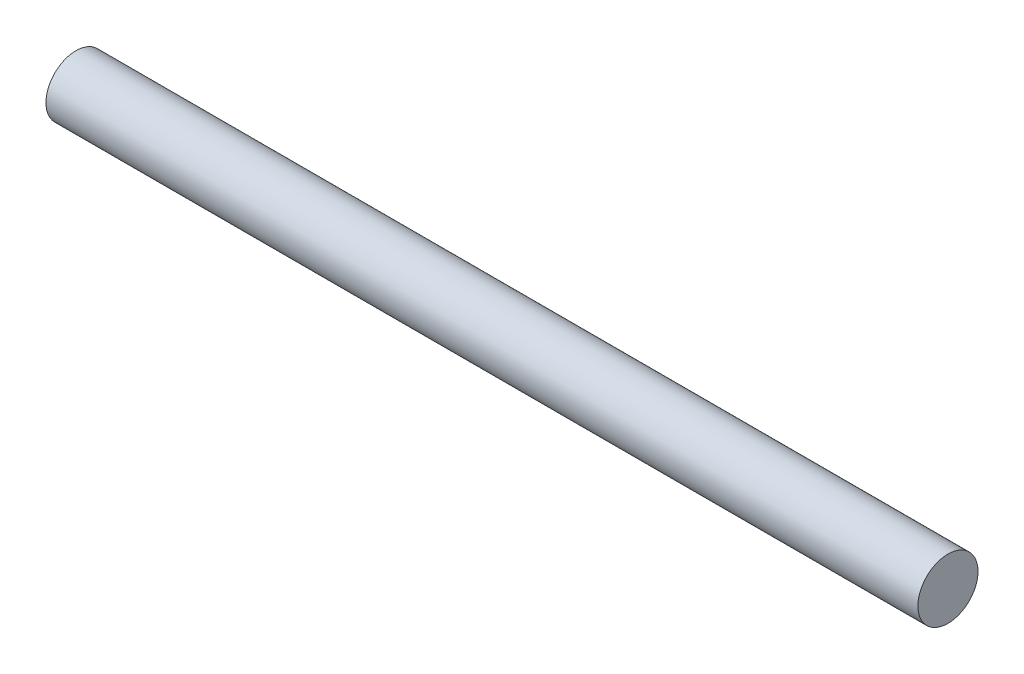
ISO-10303-21;
HEADER;
FILE_DESCRIPTION(('STEP AP214'),'2;1');
FILE_NAME('part.step','',(''),(''),'','','');
FILE_SCHEMA(('AUTOMOTIVE_DESIGN { 1 0 10303 214 1 1 1 1 }'));
ENDSEC;
DATA;
#1=APPLICATION_CONTEXT('core data for automotive mechanical design processes');
#2=APPLICATION_PROTOCOL_DEFINITION('international standard','automotive_design',2000,#1);
#3=PRODUCT_CONTEXT('',#1,'mechanical');
#4=PRODUCT('Part','Part','',(#3));
#5=PRODUCT_RELATED_PRODUCT_CATEGORY('part','',(#4));
#6=PRODUCT_DEFINITION_FORMATION('','',#4);
#7=PRODUCT_DEFINITION_CONTEXT('part definition',#1,'design');
#8=PRODUCT_DEFINITION('design','',#6,#7);
#9=PRODUCT_DEFINITION_SHAPE('','',#8);
#10=(LENGTH_UNIT() NAMED_UNIT(*) SI_UNIT(.MILLI.,.METRE.));
#11=(NAMED_UNIT(*) PLANE_ANGLE_UNIT() SI_UNIT($,.RADIAN.));
#12=(NAMED_UNIT(*) SI_UNIT($,.STERADIAN.) SOLID_ANGLE_UNIT());
#13=UNCERTAINTY_MEASURE_WITH_UNIT(LENGTH_MEASURE(1.E-05),#10,'distance_accuracy_value','');
#14=(GEOMETRIC_REPRESENTATION_CONTEXT(3) GLOBAL_UNCERTAINTY_ASSIGNED_CONTEXT((#13)) GLOBAL_UNIT_ASSIGNED_CONTEXT((#10,
#11,#12)) REPRESENTATION_CONTEXT('',''));
#15=CARTESIAN_POINT('',(0.,0.,0.));
#16=DIRECTION('',(0.,0.,1.));
#17=DIRECTION('',(1.,0.,0.));
#18=AXIS2_PLACEMENT_3D('',#15,#16,#17);
#19=CARTESIAN_POINT('',(23.01875,0.,0.));
#20=DIRECTION('',(-1.,0.,0.));
#21=DIRECTION('',(0.,0.,1.));
#22=AXIS2_PLACEMENT_3D('',#19,#20,#21);
#23=CYLINDRICAL_SURFACE('',#22,1.5875);
#24=CARTESIAN_POINT('',(23.01875,0.,0.));
#25=DIRECTION('',(1.,0.,0.));
#26=DIRECTION('',(0.,0.,-1.));
#27=AXIS2_PLACEMENT_3D('',#24,#25,#26);
#28=CIRCLE('',#27,1.5875);
#29=CARTESIAN_POINT('',(23.01875,0.,-1.5875));
#30=VERTEX_POINT('',#29);
#31=EDGE_CURVE('E10',#30,#30,#28,.T.);
#32=ORIENTED_EDGE('',*,*,#31,.F.);
#33=EDGE_LOOP('',(#32));
#34=FACE_BOUND('',#33,.T.);
#35=CARTESIAN_POINT('',(-23.01875,0.,0.));
#36=DIRECTION('',(1.,0.,0.));
#37=DIRECTION('',(0.,0.,-1.));
#38=AXIS2_PLACEMENT_3D('',#35,#36,#37);
#39=CIRCLE('',#38,1.5875);
#40=CARTESIAN_POINT('',(-23.01875,0.,-1.5875));
#41=VERTEX_POINT('',#40);
#42=EDGE_CURVE('E33',#41,#41,#39,.T.);
#43=ORIENTED_EDGE('',*,*,#42,.T.);
#44=EDGE_LOOP('',(#43));
#45=FACE_BOUND('',#44,.T.);
#46=ADVANCED_FACE('F30',(#34,#45),#23,.T.);
#47=CARTESIAN_POINT('',(23.01875,0.,0.));
#48=DIRECTION('',(1.,0.,0.));
#49=DIRECTION('',(0.,0.,-1.));
#50=AXIS2_PLACEMENT_3D('',#47,#48,#49);
#51=PLANE('',#50);
#52=ORIENTED_EDGE('',*,*,#31,.T.);
#53=EDGE_LOOP('',(#52));
#54=FACE_BOUND('',#53,.T.);
#55=ADVANCED_FACE('F45',(#54),#51,.T.);
#56=CARTESIAN_POINT('',(-23.01875,0.,0.));
#57=DIRECTION('',(1.,0.,0.));
#58=DIRECTION('',(0.,0.,-1.));
#59=AXIS2_PLACEMENT_3D('',#56,#57,#58);
#60=PLANE('',#59);
#61=ORIENTED_EDGE('',*,*,#42,.F.);
#62=EDGE_LOOP('',(#61));
#63=FACE_BOUND('',#62,.T.);
#64=ADVANCED_FACE('F43',(#63),#60,.F.);
#65=CLOSED_SHELL('',(#46,#55,#64));
#66=MANIFOLD_SOLID_BREP('B2',#65);
#67=ADVANCED_BREP_SHAPE_REPRESENTATION('',(#18,#66),#14);
#68=SHAPE_DEFINITION_REPRESENTATION(#9,#67);
ENDSEC;
END-ISO-10303-21;
